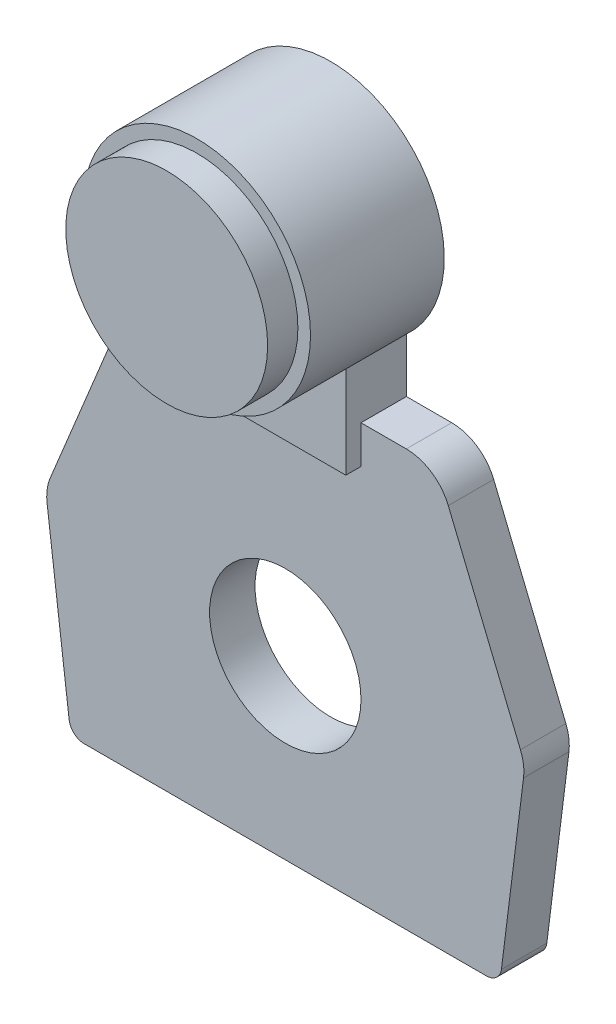
ISO-10303-21;
HEADER;
FILE_DESCRIPTION(('STEP AP214'),'2;1');
FILE_NAME('part.step','',(''),(''),'','','');
FILE_SCHEMA(('AUTOMOTIVE_DESIGN { 1 0 10303 214 1 1 1 1 }'));
ENDSEC;
DATA;
#1=APPLICATION_CONTEXT('core data for automotive mechanical design processes');
#2=APPLICATION_PROTOCOL_DEFINITION('international standard','automotive_design',2000,#1);
#3=PRODUCT_CONTEXT('',#1,'mechanical');
#4=PRODUCT('Part','Part','',(#3));
#5=PRODUCT_RELATED_PRODUCT_CATEGORY('part','',(#4));
#6=PRODUCT_DEFINITION_FORMATION('','',#4);
#7=PRODUCT_DEFINITION_CONTEXT('part definition',#1,'design');
#8=PRODUCT_DEFINITION('design','',#6,#7);
#9=PRODUCT_DEFINITION_SHAPE('','',#8);
#10=(LENGTH_UNIT() NAMED_UNIT(*) SI_UNIT(.MILLI.,.METRE.));
#11=(NAMED_UNIT(*) PLANE_ANGLE_UNIT() SI_UNIT($,.RADIAN.));
#12=(NAMED_UNIT(*) SI_UNIT($,.STERADIAN.) SOLID_ANGLE_UNIT());
#13=UNCERTAINTY_MEASURE_WITH_UNIT(LENGTH_MEASURE(1.E-05),#10,'distance_accuracy_value','');
#14=(GEOMETRIC_REPRESENTATION_CONTEXT(3) GLOBAL_UNCERTAINTY_ASSIGNED_CONTEXT((#13)) GLOBAL_UNIT_ASSIGNED_CONTEXT((#10,
#11,#12)) REPRESENTATION_CONTEXT('',''));
#15=CARTESIAN_POINT('',(0.,0.,0.));
#16=DIRECTION('',(0.,0.,1.));
#17=DIRECTION('',(1.,0.,0.));
#18=AXIS2_PLACEMENT_3D('',#15,#16,#17);
#19=CARTESIAN_POINT('',(-30.,150.,96.));
#20=DIRECTION('',(1.,0.,0.));
#21=DIRECTION('',(0.,0.,-1.));
#22=AXIS2_PLACEMENT_3D('',#19,#20,#21);
#23=PLANE('',#22);
#24=DIRECTION('',(0.,0.,-1.));
#25=VECTOR('',#24,1.);
#26=CARTESIAN_POINT('',(-30.,116.458980337503,125.));
#27=LINE('',#26,#25);
#28=CARTESIAN_POINT('',(-30.,116.458980337503,72.));
#29=VERTEX_POINT('',#28);
#30=CARTESIAN_POINT('',(-30.,116.458980337503,96.));
#31=VERTEX_POINT('',#30);
#32=EDGE_CURVE('E59',#29,#31,#27,.F.);
#33=ORIENTED_EDGE('',*,*,#32,.F.);
#34=DIRECTION('',(0.,-1.,0.));
#35=VECTOR('',#34,1.);
#36=CARTESIAN_POINT('',(-30.,150.,72.));
#37=LINE('',#36,#35);
#38=CARTESIAN_POINT('',(-30.,95.,72.));
#39=VERTEX_POINT('',#38);
#40=EDGE_CURVE('E179',#29,#39,#37,.T.);
#41=ORIENTED_EDGE('',*,*,#40,.T.);
#42=DIRECTION('',(0.,0.,1.));
#43=VECTOR('',#42,1.);
#44=CARTESIAN_POINT('',(-30.,95.,90.));
#45=LINE('',#44,#43);
#46=CARTESIAN_POINT('',(-30.,95.,90.));
#47=VERTEX_POINT('',#46);
#48=EDGE_CURVE('E203',#39,#47,#45,.T.);
#49=ORIENTED_EDGE('',*,*,#48,.T.);
#50=DIRECTION('',(0.,1.,0.));
#51=VECTOR('',#50,1.);
#52=CARTESIAN_POINT('',(-30.,-64.,90.));
#53=LINE('',#52,#51);
#54=CARTESIAN_POINT('',(-30.,80.,90.));
#55=VERTEX_POINT('',#54);
#56=EDGE_CURVE('E299',#55,#47,#53,.T.);
#57=ORIENTED_EDGE('',*,*,#56,.F.);
#58=DIRECTION('',(0.,0.,-1.));
#59=VECTOR('',#58,1.);
#60=CARTESIAN_POINT('',(-30.,80.,96.));
#61=LINE('',#60,#59);
#62=CARTESIAN_POINT('',(-30.,80.,96.));
#63=VERTEX_POINT('',#62);
#64=EDGE_CURVE('E200',#63,#55,#61,.T.);
#65=ORIENTED_EDGE('',*,*,#64,.F.);
#66=DIRECTION('',(0.,-1.,0.));
#67=VECTOR('',#66,1.);
#68=CARTESIAN_POINT('',(-30.,150.,96.));
#69=LINE('',#68,#67);
#70=EDGE_CURVE('E182',#31,#63,#69,.T.);
#71=ORIENTED_EDGE('',*,*,#70,.F.);
#72=EDGE_LOOP('',(#33,#41,#49,#57,#65,#71));
#73=FACE_BOUND('',#72,.T.);
#74=ADVANCED_FACE('F41',(#73),#23,.F.);
#75=CARTESIAN_POINT('',(30.,80.,96.));
#76=DIRECTION('',(-1.,0.,0.));
#77=DIRECTION('',(0.,0.,1.));
#78=AXIS2_PLACEMENT_3D('',#75,#76,#77);
#79=PLANE('',#78);
#80=DIRECTION('',(0.,0.,-1.));
#81=VECTOR('',#80,1.);
#82=CARTESIAN_POINT('',(30.,116.458980337503,125.));
#83=LINE('',#82,#81);
#84=CARTESIAN_POINT('',(30.,116.458980337503,96.));
#85=VERTEX_POINT('',#84);
#86=CARTESIAN_POINT('',(30.,116.458980337503,72.));
#87=VERTEX_POINT('',#86);
#88=EDGE_CURVE('E167',#85,#87,#83,.T.);
#89=ORIENTED_EDGE('',*,*,#88,.F.);
#90=DIRECTION('',(0.,1.,0.));
#91=VECTOR('',#90,1.);
#92=CARTESIAN_POINT('',(30.,80.,96.));
#93=LINE('',#92,#91);
#94=CARTESIAN_POINT('',(30.,80.,96.));
#95=VERTEX_POINT('',#94);
#96=EDGE_CURVE('E194',#95,#85,#93,.T.);
#97=ORIENTED_EDGE('',*,*,#96,.F.);
#98=DIRECTION('',(0.,0.,-1.));
#99=VECTOR('',#98,1.);
#100=CARTESIAN_POINT('',(30.,80.,96.));
#101=LINE('',#100,#99);
#102=CARTESIAN_POINT('',(30.,80.,90.));
#103=VERTEX_POINT('',#102);
#104=EDGE_CURVE('E67',#95,#103,#101,.T.);
#105=ORIENTED_EDGE('',*,*,#104,.T.);
#106=DIRECTION('',(0.,-1.,0.));
#107=VECTOR('',#106,1.);
#108=CARTESIAN_POINT('',(30.,-64.,90.));
#109=LINE('',#108,#107);
#110=CARTESIAN_POINT('',(30.,95.,90.));
#111=VERTEX_POINT('',#110);
#112=EDGE_CURVE('E298',#111,#103,#109,.T.);
#113=ORIENTED_EDGE('',*,*,#112,.F.);
#114=DIRECTION('',(0.,0.,-1.));
#115=VECTOR('',#114,1.);
#116=CARTESIAN_POINT('',(30.,95.,90.));
#117=LINE('',#116,#115);
#118=CARTESIAN_POINT('',(30.,95.,72.));
#119=VERTEX_POINT('',#118);
#120=EDGE_CURVE('E205',#111,#119,#117,.T.);
#121=ORIENTED_EDGE('',*,*,#120,.T.);
#122=DIRECTION('',(0.,1.,0.));
#123=VECTOR('',#122,1.);
#124=CARTESIAN_POINT('',(30.,80.,72.));
#125=LINE('',#124,#123);
#126=EDGE_CURVE('E186',#119,#87,#125,.T.);
#127=ORIENTED_EDGE('',*,*,#126,.T.);
#128=EDGE_LOOP('',(#89,#97,#105,#113,#121,#127));
#129=FACE_BOUND('',#128,.T.);
#130=ADVANCED_FACE('F304',(#129),#79,.F.);
#131=CARTESIAN_POINT('',(47.9455309649821,95.,90.));
#132=DIRECTION('',(0.,-1.,0.));
#133=DIRECTION('',(0.,0.,-1.));
#134=AXIS2_PLACEMENT_3D('',#131,#132,#133);
#135=PLANE('',#134);
#136=ORIENTED_EDGE('',*,*,#48,.F.);
#137=DIRECTION('',(-1.,0.,0.));
#138=VECTOR('',#137,1.);
#139=CARTESIAN_POINT('',(47.9455309649821,95.,72.));
#140=LINE('',#139,#138);
#141=CARTESIAN_POINT('',(-47.9455309649821,95.,72.));
#142=VERTEX_POINT('',#141);
#143=EDGE_CURVE('E189',#39,#142,#140,.T.);
#144=ORIENTED_EDGE('',*,*,#143,.T.);
#145=DIRECTION('',(0.,0.,-1.));
#146=VECTOR('',#145,1.);
#147=CARTESIAN_POINT('',(-47.9455309649821,95.,90.));
#148=LINE('',#147,#146);
#149=CARTESIAN_POINT('',(-47.9455309649821,95.,90.));
#150=VERTEX_POINT('',#149);
#151=EDGE_CURVE('E275',#150,#142,#148,.T.);
#152=ORIENTED_EDGE('',*,*,#151,.F.);
#153=DIRECTION('',(-1.,0.,0.));
#154=VECTOR('',#153,1.);
#155=CARTESIAN_POINT('',(47.9455309649821,95.,90.));
#156=LINE('',#155,#154);
#157=EDGE_CURVE('E221',#47,#150,#156,.T.);
#158=ORIENTED_EDGE('',*,*,#157,.F.);
#159=EDGE_LOOP('',(#136,#144,#152,#158));
#160=FACE_BOUND('',#159,.T.);
#161=ADVANCED_FACE('F372',(#160),#135,.F.);
#162=ORIENTED_EDGE('',*,*,#120,.F.);
#163=CARTESIAN_POINT('',(47.9455309649821,95.,90.));
#164=VERTEX_POINT('',#163);
#165=EDGE_CURVE('E223',#164,#111,#156,.T.);
#166=ORIENTED_EDGE('',*,*,#165,.F.);
#167=DIRECTION('',(0.,0.,-1.));
#168=VECTOR('',#167,1.);
#169=CARTESIAN_POINT('',(47.9455309649821,95.,90.));
#170=LINE('',#169,#168);
#171=CARTESIAN_POINT('',(47.9455309649821,95.,72.));
#172=VERTEX_POINT('',#171);
#173=EDGE_CURVE('E273',#164,#172,#170,.T.);
#174=ORIENTED_EDGE('',*,*,#173,.T.);
#175=EDGE_CURVE('E252',#172,#119,#140,.T.);
#176=ORIENTED_EDGE('',*,*,#175,.T.);
#177=EDGE_LOOP('',(#162,#166,#174,#176));
#178=FACE_BOUND('',#177,.T.);
#179=ADVANCED_FACE('F319',(#178),#135,.F.);
#180=CARTESIAN_POINT('',(-79.7033066887761,-64.,90.));
#181=DIRECTION('',(0.,0.,1.));
#182=DIRECTION('',(1.,0.,0.));
#183=AXIS2_PLACEMENT_3D('',#180,#181,#182);
#184=PLANE('',#183);
#185=CARTESIAN_POINT('',(0.,0.,90.));
#186=DIRECTION('',(0.,0.,1.));
#187=DIRECTION('',(1.,0.,0.));
#188=AXIS2_PLACEMENT_3D('',#185,#186,#187);
#189=CIRCLE('',#188,30.);
#190=CARTESIAN_POINT('',(30.,0.,90.));
#191=VERTEX_POINT('',#190);
#192=EDGE_CURVE('E582',#191,#191,#189,.F.);
#193=ORIENTED_EDGE('',*,*,#192,.T.);
#194=EDGE_LOOP('',(#193));
#195=FACE_BOUND('',#194,.T.);
#196=DIRECTION('',(-1.,0.,0.));
#197=VECTOR('',#196,1.);
#198=CARTESIAN_POINT('',(-79.7033066887761,80.,90.));
#199=LINE('',#198,#197);
#200=EDGE_CURVE('E196',#103,#55,#199,.T.);
#201=ORIENTED_EDGE('',*,*,#200,.T.);
#202=ORIENTED_EDGE('',*,*,#56,.T.);
#203=ORIENTED_EDGE('',*,*,#157,.T.);
#204=CARTESIAN_POINT('',(-47.9455309649821,77.,90.));
#205=DIRECTION('',(0.,0.,1.));
#206=DIRECTION('',(1.,0.,0.));
#207=AXIS2_PLACEMENT_3D('',#204,#205,#206);
#208=CIRCLE('',#207,18.);
#209=CARTESIAN_POINT('',(-64.589736737527,83.8534964945773,90.));
#210=VERTEX_POINT('',#209);
#211=EDGE_CURVE('E226',#150,#210,#208,.T.);
#212=ORIENTED_EDGE('',*,*,#211,.T.);
#213=DIRECTION('',(-0.380749805254295,-0.924678098474716,0.));
#214=VECTOR('',#213,1.);
#215=CARTESIAN_POINT('',(-64.589736737527,83.8534964945773,90.));
#216=LINE('',#215,#214);
#217=CARTESIAN_POINT('',(-93.1952955002035,14.3828537852201,90.));
#218=VERTEX_POINT('',#217);
#219=EDGE_CURVE('E229',#210,#218,#216,.T.);
#220=ORIENTED_EDGE('',*,*,#219,.T.);
#221=CARTESIAN_POINT('',(-76.5510897276586,7.52935729064277,90.));
#222=DIRECTION('',(0.,0.,1.));
#223=DIRECTION('',(1.,0.,0.));
#224=AXIS2_PLACEMENT_3D('',#221,#222,#223);
#225=CIRCLE('',#224,18.);
#226=CARTESIAN_POINT('',(-94.4120915085046,5.29673206803702,90.));
#227=VERTEX_POINT('',#226);
#228=EDGE_CURVE('E235',#218,#227,#225,.T.);
#229=ORIENTED_EDGE('',*,*,#228,.T.);
#230=DIRECTION('',(0.124034734589208,-0.992277876713668,0.));
#231=VECTOR('',#230,1.);
#232=CARTESIAN_POINT('',(-94.4120915085046,5.29673206803702,90.));
#233=LINE('',#232,#231);
#234=CARTESIAN_POINT('',(-85.6569739490581,-64.7442084075353,90.));
#235=VERTEX_POINT('',#234);
#236=EDGE_CURVE('E234',#227,#235,#233,.T.);
#237=ORIENTED_EDGE('',*,*,#236,.T.);
#238=CARTESIAN_POINT('',(-79.7033066887761,-64.,90.));
#239=DIRECTION('',(0.,0.,1.));
#240=DIRECTION('',(1.,0.,0.));
#241=AXIS2_PLACEMENT_3D('',#238,#239,#240);
#242=CIRCLE('',#241,6.);
#243=CARTESIAN_POINT('',(-79.7033066887761,-70.,90.));
#244=VERTEX_POINT('',#243);
#245=EDGE_CURVE('E206',#235,#244,#242,.T.);
#246=ORIENTED_EDGE('',*,*,#245,.T.);
#247=DIRECTION('',(1.,0.,0.));
#248=VECTOR('',#247,1.);
#249=CARTESIAN_POINT('',(-79.7033066887761,-70.,90.));
#250=LINE('',#249,#248);
#251=CARTESIAN_POINT('',(79.7033066887761,-70.,90.));
#252=VERTEX_POINT('',#251);
#253=EDGE_CURVE('E211',#244,#252,#250,.T.);
#254=ORIENTED_EDGE('',*,*,#253,.T.);
#255=CARTESIAN_POINT('',(79.7033066887761,-64.,90.));
#256=DIRECTION('',(0.,0.,1.));
#257=DIRECTION('',(1.,0.,0.));
#258=AXIS2_PLACEMENT_3D('',#255,#256,#257);
#259=CIRCLE('',#258,6.);
#260=CARTESIAN_POINT('',(85.6569739490581,-64.7442084075353,90.));
#261=VERTEX_POINT('',#260);
#262=EDGE_CURVE('E213',#252,#261,#259,.T.);
#263=ORIENTED_EDGE('',*,*,#262,.T.);
#264=DIRECTION('',(0.124034734589208,0.992277876713668,0.));
#265=VECTOR('',#264,1.);
#266=CARTESIAN_POINT('',(85.6569739490581,-64.7442084075353,90.));
#267=LINE('',#266,#265);
#268=CARTESIAN_POINT('',(94.4120915085046,5.29673206803701,90.));
#269=VERTEX_POINT('',#268);
#270=EDGE_CURVE('E217',#261,#269,#267,.T.);
#271=ORIENTED_EDGE('',*,*,#270,.T.);
#272=CARTESIAN_POINT('',(76.5510897276586,7.52935729064277,90.));
#273=DIRECTION('',(0.,0.,1.));
#274=DIRECTION('',(1.,0.,0.));
#275=AXIS2_PLACEMENT_3D('',#272,#273,#274);
#276=CIRCLE('',#275,18.);
#277=CARTESIAN_POINT('',(93.1952955002035,14.3828537852201,90.));
#278=VERTEX_POINT('',#277);
#279=EDGE_CURVE('E218',#269,#278,#276,.T.);
#280=ORIENTED_EDGE('',*,*,#279,.T.);
#281=DIRECTION('',(-0.380749805254295,0.924678098474716,0.));
#282=VECTOR('',#281,1.);
#283=CARTESIAN_POINT('',(93.1952955002035,14.3828537852201,90.));
#284=LINE('',#283,#282);
#285=CARTESIAN_POINT('',(64.589736737527,83.8534964945773,90.));
#286=VERTEX_POINT('',#285);
#287=EDGE_CURVE('E216',#278,#286,#284,.T.);
#288=ORIENTED_EDGE('',*,*,#287,.T.);
#289=CARTESIAN_POINT('',(47.9455309649821,77.,90.));
#290=DIRECTION('',(0.,0.,1.));
#291=DIRECTION('',(1.,0.,0.));
#292=AXIS2_PLACEMENT_3D('',#289,#290,#291);
#293=CIRCLE('',#292,18.);
#294=EDGE_CURVE('E224',#286,#164,#293,.T.);
#295=ORIENTED_EDGE('',*,*,#294,.T.);
#296=ORIENTED_EDGE('',*,*,#165,.T.);
#297=ORIENTED_EDGE('',*,*,#112,.T.);
#298=EDGE_LOOP('',(#201,#202,#203,#212,#220,#229,#237,#246,#254,#263,#271,#280,#288,#295,#296,#297));
#299=FACE_BOUND('',#298,.T.);
#300=ADVANCED_FACE('F313',(#195,#299),#184,.T.);
#301=CARTESIAN_POINT('',(-79.7033066887761,-64.,90.));
#302=DIRECTION('',(0.,0.,-1.));
#303=DIRECTION('',(-1.,0.,0.));
#304=AXIS2_PLACEMENT_3D('',#301,#302,#303);
#305=CYLINDRICAL_SURFACE('',#304,6.);
#306=CARTESIAN_POINT('',(-79.7033066887761,-64.,72.));
#307=DIRECTION('',(0.,0.,1.));
#308=DIRECTION('',(1.,0.,0.));
#309=AXIS2_PLACEMENT_3D('',#306,#307,#308);
#310=CIRCLE('',#309,6.);
#311=CARTESIAN_POINT('',(-85.6569739490581,-64.7442084075353,72.));
#312=VERTEX_POINT('',#311);
#313=CARTESIAN_POINT('',(-79.7033066887761,-70.,72.));
#314=VERTEX_POINT('',#313);
#315=EDGE_CURVE('E210',#312,#314,#310,.T.);
#316=ORIENTED_EDGE('',*,*,#315,.T.);
#317=DIRECTION('',(0.,0.,-1.));
#318=VECTOR('',#317,1.);
#319=CARTESIAN_POINT('',(-79.7033066887761,-70.,90.));
#320=LINE('',#319,#318);
#321=EDGE_CURVE('E291',#244,#314,#320,.T.);
#322=ORIENTED_EDGE('',*,*,#321,.F.);
#323=ORIENTED_EDGE('',*,*,#245,.F.);
#324=DIRECTION('',(0.,0.,-1.));
#325=VECTOR('',#324,1.);
#326=CARTESIAN_POINT('',(-85.6569739490581,-64.7442084075353,90.));
#327=LINE('',#326,#325);
#328=EDGE_CURVE('E236',#235,#312,#327,.T.);
#329=ORIENTED_EDGE('',*,*,#328,.T.);
#330=EDGE_LOOP('',(#316,#322,#323,#329));
#331=FACE_BOUND('',#330,.T.);
#332=ADVANCED_FACE('F43',(#331),#305,.T.);
#333=CARTESIAN_POINT('',(-79.7033066887761,-70.,90.));
#334=DIRECTION('',(0.,1.,0.));
#335=DIRECTION('',(0.,0.,1.));
#336=AXIS2_PLACEMENT_3D('',#333,#334,#335);
#337=PLANE('',#336);
#338=DIRECTION('',(1.,0.,0.));
#339=VECTOR('',#338,1.);
#340=CARTESIAN_POINT('',(-79.7033066887761,-70.,72.));
#341=LINE('',#340,#339);
#342=CARTESIAN_POINT('',(79.7033066887761,-70.,72.));
#343=VERTEX_POINT('',#342);
#344=EDGE_CURVE('E237',#314,#343,#341,.T.);
#345=ORIENTED_EDGE('',*,*,#344,.T.);
#346=DIRECTION('',(0.,0.,-1.));
#347=VECTOR('',#346,1.);
#348=CARTESIAN_POINT('',(79.7033066887761,-70.,90.));
#349=LINE('',#348,#347);
#350=EDGE_CURVE('E288',#252,#343,#349,.T.);
#351=ORIENTED_EDGE('',*,*,#350,.F.);
#352=ORIENTED_EDGE('',*,*,#253,.F.);
#353=ORIENTED_EDGE('',*,*,#321,.T.);
#354=EDGE_LOOP('',(#345,#351,#352,#353));
#355=FACE_BOUND('',#354,.T.);
#356=ADVANCED_FACE('F350',(#355),#337,.F.);
#357=CARTESIAN_POINT('',(79.7033066887761,-64.,90.));
#358=DIRECTION('',(0.,0.,-1.));
#359=DIRECTION('',(-1.,0.,0.));
#360=AXIS2_PLACEMENT_3D('',#357,#358,#359);
#361=CYLINDRICAL_SURFACE('',#360,6.);
#362=CARTESIAN_POINT('',(79.7033066887761,-64.,72.));
#363=DIRECTION('',(0.,0.,1.));
#364=DIRECTION('',(1.,0.,0.));
#365=AXIS2_PLACEMENT_3D('',#362,#363,#364);
#366=CIRCLE('',#365,6.);
#367=CARTESIAN_POINT('',(85.6569739490581,-64.7442084075353,72.));
#368=VERTEX_POINT('',#367);
#369=EDGE_CURVE('E241',#343,#368,#366,.T.);
#370=ORIENTED_EDGE('',*,*,#369,.T.);
#371=DIRECTION('',(0.,0.,-1.));
#372=VECTOR('',#371,1.);
#373=CARTESIAN_POINT('',(85.6569739490581,-64.7442084075353,90.));
#374=LINE('',#373,#372);
#375=EDGE_CURVE('E289',#261,#368,#374,.T.);
#376=ORIENTED_EDGE('',*,*,#375,.F.);
#377=ORIENTED_EDGE('',*,*,#262,.F.);
#378=ORIENTED_EDGE('',*,*,#350,.T.);
#379=EDGE_LOOP('',(#370,#376,#377,#378));
#380=FACE_BOUND('',#379,.T.);
#381=ADVANCED_FACE('F343',(#380),#361,.T.);
#382=CARTESIAN_POINT('',(85.6569739490581,-64.7442084075353,90.));
#383=DIRECTION('',(-0.992277876713668,0.124034734589209,0.));
#384=DIRECTION('',(-0.124034734589209,-0.992277876713668,0.));
#385=AXIS2_PLACEMENT_3D('',#382,#383,#384);
#386=PLANE('',#385);
#387=DIRECTION('',(0.124034734589208,0.992277876713668,0.));
#388=VECTOR('',#387,1.);
#389=CARTESIAN_POINT('',(85.6569739490581,-64.7442084075353,72.));
#390=LINE('',#389,#388);
#391=CARTESIAN_POINT('',(94.4120915085046,5.29673206803701,72.));
#392=VERTEX_POINT('',#391);
#393=EDGE_CURVE('E243',#368,#392,#390,.T.);
#394=ORIENTED_EDGE('',*,*,#393,.T.);
#395=DIRECTION('',(0.,0.,-1.));
#396=VECTOR('',#395,1.);
#397=CARTESIAN_POINT('',(94.4120915085046,5.29673206803701,90.));
#398=LINE('',#397,#396);
#399=EDGE_CURVE('E284',#269,#392,#398,.T.);
#400=ORIENTED_EDGE('',*,*,#399,.F.);
#401=ORIENTED_EDGE('',*,*,#270,.F.);
#402=ORIENTED_EDGE('',*,*,#375,.T.);
#403=EDGE_LOOP('',(#394,#400,#401,#402));
#404=FACE_BOUND('',#403,.T.);
#405=ADVANCED_FACE('F339',(#404),#386,.F.);
#406=CARTESIAN_POINT('',(76.5510897276586,7.52935729064277,90.));
#407=DIRECTION('',(0.,0.,-1.));
#408=DIRECTION('',(-1.,0.,0.));
#409=AXIS2_PLACEMENT_3D('',#406,#407,#408);
#410=CYLINDRICAL_SURFACE('',#409,18.);
#411=CARTESIAN_POINT('',(76.5510897276586,7.52935729064277,72.));
#412=DIRECTION('',(0.,0.,1.));
#413=DIRECTION('',(1.,0.,0.));
#414=AXIS2_PLACEMENT_3D('',#411,#412,#413);
#415=CIRCLE('',#414,18.);
#416=CARTESIAN_POINT('',(93.1952955002035,14.3828537852201,72.));
#417=VERTEX_POINT('',#416);
#418=EDGE_CURVE('E244',#392,#417,#415,.T.);
#419=ORIENTED_EDGE('',*,*,#418,.T.);
#420=DIRECTION('',(0.,0.,-1.));
#421=VECTOR('',#420,1.);
#422=CARTESIAN_POINT('',(93.1952955002035,14.3828537852201,90.));
#423=LINE('',#422,#421);
#424=EDGE_CURVE('E282',#278,#417,#423,.T.);
#425=ORIENTED_EDGE('',*,*,#424,.F.);
#426=ORIENTED_EDGE('',*,*,#279,.F.);
#427=ORIENTED_EDGE('',*,*,#399,.T.);
#428=EDGE_LOOP('',(#419,#425,#426,#427));
#429=FACE_BOUND('',#428,.T.);
#430=ADVANCED_FACE('F331',(#429),#410,.T.);
#431=CARTESIAN_POINT('',(93.1952955002035,14.3828537852201,90.));
#432=DIRECTION('',(-0.924678098474716,-0.380749805254295,0.));
#433=DIRECTION('',(0.380749805254295,-0.924678098474716,0.));
#434=AXIS2_PLACEMENT_3D('',#431,#432,#433);
#435=PLANE('',#434);
#436=DIRECTION('',(-0.380749805254295,0.924678098474716,0.));
#437=VECTOR('',#436,1.);
#438=CARTESIAN_POINT('',(93.1952955002035,14.3828537852201,72.));
#439=LINE('',#438,#437);
#440=CARTESIAN_POINT('',(64.589736737527,83.8534964945773,72.));
#441=VERTEX_POINT('',#440);
#442=EDGE_CURVE('E250',#417,#441,#439,.T.);
#443=ORIENTED_EDGE('',*,*,#442,.T.);
#444=DIRECTION('',(0.,0.,-1.));
#445=VECTOR('',#444,1.);
#446=CARTESIAN_POINT('',(64.589736737527,83.8534964945773,90.));
#447=LINE('',#446,#445);
#448=EDGE_CURVE('E279',#286,#441,#447,.T.);
#449=ORIENTED_EDGE('',*,*,#448,.F.);
#450=ORIENTED_EDGE('',*,*,#287,.F.);
#451=ORIENTED_EDGE('',*,*,#424,.T.);
#452=EDGE_LOOP('',(#443,#449,#450,#451));
#453=FACE_BOUND('',#452,.T.);
#454=ADVANCED_FACE('F326',(#453),#435,.F.);
#455=CARTESIAN_POINT('',(47.9455309649821,77.,90.));
#456=DIRECTION('',(0.,0.,-1.));
#457=DIRECTION('',(-1.,0.,0.));
#458=AXIS2_PLACEMENT_3D('',#455,#456,#457);
#459=CYLINDRICAL_SURFACE('',#458,18.);
#460=CARTESIAN_POINT('',(47.9455309649821,77.,72.));
#461=DIRECTION('',(0.,0.,1.));
#462=DIRECTION('',(1.,0.,0.));
#463=AXIS2_PLACEMENT_3D('',#460,#461,#462);
#464=CIRCLE('',#463,18.);
#465=EDGE_CURVE('E248',#441,#172,#464,.T.);
#466=ORIENTED_EDGE('',*,*,#465,.T.);
#467=ORIENTED_EDGE('',*,*,#173,.F.);
#468=ORIENTED_EDGE('',*,*,#294,.F.);
#469=ORIENTED_EDGE('',*,*,#448,.T.);
#470=EDGE_LOOP('',(#466,#467,#468,#469));
#471=FACE_BOUND('',#470,.T.);
#472=ADVANCED_FACE('F325',(#471),#459,.T.);
#473=CARTESIAN_POINT('',(-47.9455309649821,77.,90.));
#474=DIRECTION('',(0.,0.,-1.));
#475=DIRECTION('',(-1.,0.,0.));
#476=AXIS2_PLACEMENT_3D('',#473,#474,#475);
#477=CYLINDRICAL_SURFACE('',#476,18.);
#478=CARTESIAN_POINT('',(-47.9455309649821,77.,72.));
#479=DIRECTION('',(0.,0.,1.));
#480=DIRECTION('',(1.,0.,0.));
#481=AXIS2_PLACEMENT_3D('',#478,#479,#480);
#482=CIRCLE('',#481,18.);
#483=CARTESIAN_POINT('',(-64.589736737527,83.8534964945773,72.));
#484=VERTEX_POINT('',#483);
#485=EDGE_CURVE('E251',#142,#484,#482,.T.);
#486=ORIENTED_EDGE('',*,*,#485,.T.);
#487=DIRECTION('',(0.,0.,-1.));
#488=VECTOR('',#487,1.);
#489=CARTESIAN_POINT('',(-64.589736737527,83.8534964945773,90.));
#490=LINE('',#489,#488);
#491=EDGE_CURVE('E266',#210,#484,#490,.T.);
#492=ORIENTED_EDGE('',*,*,#491,.F.);
#493=ORIENTED_EDGE('',*,*,#211,.F.);
#494=ORIENTED_EDGE('',*,*,#151,.T.);
#495=EDGE_LOOP('',(#486,#492,#493,#494));
#496=FACE_BOUND('',#495,.T.);
#497=ADVANCED_FACE('F369',(#496),#477,.T.);
#498=CARTESIAN_POINT('',(-64.589736737527,83.8534964945773,90.));
#499=DIRECTION('',(0.924678098474716,-0.380749805254295,0.));
#500=DIRECTION('',(0.380749805254295,0.924678098474716,0.));
#501=AXIS2_PLACEMENT_3D('',#498,#499,#500);
#502=PLANE('',#501);
#503=DIRECTION('',(-0.380749805254295,-0.924678098474716,0.));
#504=VECTOR('',#503,1.);
#505=CARTESIAN_POINT('',(-64.589736737527,83.8534964945773,72.));
#506=LINE('',#505,#504);
#507=CARTESIAN_POINT('',(-93.1952955002035,14.3828537852201,72.));
#508=VERTEX_POINT('',#507);
#509=EDGE_CURVE('E256',#484,#508,#506,.T.);
#510=ORIENTED_EDGE('',*,*,#509,.T.);
#511=DIRECTION('',(0.,0.,-1.));
#512=VECTOR('',#511,1.);
#513=CARTESIAN_POINT('',(-93.1952955002035,14.3828537852201,90.));
#514=LINE('',#513,#512);
#515=EDGE_CURVE('E267',#218,#508,#514,.T.);
#516=ORIENTED_EDGE('',*,*,#515,.F.);
#517=ORIENTED_EDGE('',*,*,#219,.F.);
#518=ORIENTED_EDGE('',*,*,#491,.T.);
#519=EDGE_LOOP('',(#510,#516,#517,#518));
#520=FACE_BOUND('',#519,.T.);
#521=ADVANCED_FACE('F362',(#520),#502,.F.);
#522=CARTESIAN_POINT('',(-76.5510897276586,7.52935729064277,90.));
#523=DIRECTION('',(0.,0.,-1.));
#524=DIRECTION('',(-1.,0.,0.));
#525=AXIS2_PLACEMENT_3D('',#522,#523,#524);
#526=CYLINDRICAL_SURFACE('',#525,18.);
#527=CARTESIAN_POINT('',(-76.5510897276586,7.52935729064277,72.));
#528=DIRECTION('',(0.,0.,1.));
#529=DIRECTION('',(1.,0.,0.));
#530=AXIS2_PLACEMENT_3D('',#527,#528,#529);
#531=CIRCLE('',#530,18.);
#532=CARTESIAN_POINT('',(-94.4120915085046,5.29673206803702,72.));
#533=VERTEX_POINT('',#532);
#534=EDGE_CURVE('E259',#508,#533,#531,.T.);
#535=ORIENTED_EDGE('',*,*,#534,.T.);
#536=DIRECTION('',(0.,0.,-1.));
#537=VECTOR('',#536,1.);
#538=CARTESIAN_POINT('',(-94.4120915085046,5.29673206803702,90.));
#539=LINE('',#538,#537);
#540=EDGE_CURVE('E263',#227,#533,#539,.T.);
#541=ORIENTED_EDGE('',*,*,#540,.F.);
#542=ORIENTED_EDGE('',*,*,#228,.F.);
#543=ORIENTED_EDGE('',*,*,#515,.T.);
#544=EDGE_LOOP('',(#535,#541,#542,#543));
#545=FACE_BOUND('',#544,.T.);
#546=ADVANCED_FACE('F363',(#545),#526,.T.);
#547=CARTESIAN_POINT('',(-94.4120915085046,5.29673206803702,90.));
#548=DIRECTION('',(0.992277876713668,0.124034734589209,0.));
#549=DIRECTION('',(-0.124034734589209,0.992277876713668,0.));
#550=AXIS2_PLACEMENT_3D('',#547,#548,#549);
#551=PLANE('',#550);
#552=DIRECTION('',(0.124034734589208,-0.992277876713668,0.));
#553=VECTOR('',#552,1.);
#554=CARTESIAN_POINT('',(-94.4120915085046,5.29673206803702,72.));
#555=LINE('',#554,#553);
#556=EDGE_CURVE('E212',#533,#312,#555,.T.);
#557=ORIENTED_EDGE('',*,*,#556,.T.);
#558=ORIENTED_EDGE('',*,*,#328,.F.);
#559=ORIENTED_EDGE('',*,*,#236,.F.);
#560=ORIENTED_EDGE('',*,*,#540,.T.);
#561=EDGE_LOOP('',(#557,#558,#559,#560));
#562=FACE_BOUND('',#561,.T.);
#563=ADVANCED_FACE('F357',(#562),#551,.F.);
#564=CARTESIAN_POINT('',(-79.7033066887761,-64.,72.));
#565=DIRECTION('',(0.,0.,1.));
#566=DIRECTION('',(1.,0.,0.));
#567=AXIS2_PLACEMENT_3D('',#564,#565,#566);
#568=PLANE('',#567);
#569=CARTESIAN_POINT('',(0.,0.,72.));
#570=DIRECTION('',(0.,0.,1.));
#571=DIRECTION('',(1.,0.,0.));
#572=AXIS2_PLACEMENT_3D('',#569,#570,#571);
#573=CIRCLE('',#572,30.);
#574=CARTESIAN_POINT('',(30.,0.,72.));
#575=VERTEX_POINT('',#574);
#576=EDGE_CURVE('E44',#575,#575,#573,.F.);
#577=ORIENTED_EDGE('',*,*,#576,.F.);
#578=EDGE_LOOP('',(#577));
#579=FACE_BOUND('',#578,.T.);
#580=ORIENTED_EDGE('',*,*,#40,.F.);
#581=CARTESIAN_POINT('',(0.,150.,72.));
#582=DIRECTION('',(0.,0.,1.));
#583=DIRECTION('',(1.,0.,0.));
#584=AXIS2_PLACEMENT_3D('',#581,#582,#583);
#585=CIRCLE('',#584,45.);
#586=EDGE_CURVE('E170',#87,#29,#585,.T.);
#587=ORIENTED_EDGE('',*,*,#586,.F.);
#588=ORIENTED_EDGE('',*,*,#126,.F.);
#589=ORIENTED_EDGE('',*,*,#175,.F.);
#590=ORIENTED_EDGE('',*,*,#465,.F.);
#591=ORIENTED_EDGE('',*,*,#442,.F.);
#592=ORIENTED_EDGE('',*,*,#418,.F.);
#593=ORIENTED_EDGE('',*,*,#393,.F.);
#594=ORIENTED_EDGE('',*,*,#369,.F.);
#595=ORIENTED_EDGE('',*,*,#344,.F.);
#596=ORIENTED_EDGE('',*,*,#315,.F.);
#597=ORIENTED_EDGE('',*,*,#556,.F.);
#598=ORIENTED_EDGE('',*,*,#534,.F.);
#599=ORIENTED_EDGE('',*,*,#509,.F.);
#600=ORIENTED_EDGE('',*,*,#485,.F.);
#601=ORIENTED_EDGE('',*,*,#143,.F.);
#602=EDGE_LOOP('',(#580,#587,#588,#589,#590,#591,#592,#593,#594,#595,#596,#597,#598,#599,#600,#601));
#603=FACE_BOUND('',#602,.T.);
#604=ADVANCED_FACE('F187',(#579,#603),#568,.F.);
#605=CARTESIAN_POINT('',(-30.,80.,96.));
#606=DIRECTION('',(0.,1.,0.));
#607=DIRECTION('',(0.,0.,1.));
#608=AXIS2_PLACEMENT_3D('',#605,#606,#607);
#609=PLANE('',#608);
#610=ORIENTED_EDGE('',*,*,#200,.F.);
#611=ORIENTED_EDGE('',*,*,#104,.F.);
#612=DIRECTION('',(1.,0.,0.));
#613=VECTOR('',#612,1.);
#614=CARTESIAN_POINT('',(-30.,80.,96.));
#615=LINE('',#614,#613);
#616=EDGE_CURVE('E309',#63,#95,#615,.T.);
#617=ORIENTED_EDGE('',*,*,#616,.F.);
#618=ORIENTED_EDGE('',*,*,#64,.T.);
#619=EDGE_LOOP('',(#610,#611,#617,#618));
#620=FACE_BOUND('',#619,.T.);
#621=ADVANCED_FACE('F315',(#620),#609,.F.);
#622=CARTESIAN_POINT('',(0.,0.,96.));
#623=DIRECTION('',(0.,0.,1.));
#624=DIRECTION('',(1.,0.,0.));
#625=AXIS2_PLACEMENT_3D('',#622,#623,#624);
#626=PLANE('',#625);
#627=ORIENTED_EDGE('',*,*,#96,.T.);
#628=CARTESIAN_POINT('',(0.,150.,96.));
#629=DIRECTION('',(0.,0.,1.));
#630=DIRECTION('',(1.,0.,0.));
#631=AXIS2_PLACEMENT_3D('',#628,#629,#630);
#632=CIRCLE('',#631,45.);
#633=EDGE_CURVE('E49',#85,#31,#632,.F.);
#634=ORIENTED_EDGE('',*,*,#633,.T.);
#635=ORIENTED_EDGE('',*,*,#70,.T.);
#636=ORIENTED_EDGE('',*,*,#616,.T.);
#637=EDGE_LOOP('',(#627,#634,#635,#636));
#638=FACE_BOUND('',#637,.T.);
#639=ADVANCED_FACE('F303',(#638),#626,.T.);
#640=CARTESIAN_POINT('',(0.,150.,125.));
#641=DIRECTION('',(0.,0.,-1.));
#642=DIRECTION('',(-1.,0.,0.));
#643=AXIS2_PLACEMENT_3D('',#640,#641,#642);
#644=CYLINDRICAL_SURFACE('',#643,45.);
#645=CARTESIAN_POINT('',(0.,150.,125.));
#646=DIRECTION('',(0.,0.,1.));
#647=DIRECTION('',(1.,0.,0.));
#648=AXIS2_PLACEMENT_3D('',#645,#646,#647);
#649=CIRCLE('',#648,45.);
#650=CARTESIAN_POINT('',(45.,150.,125.));
#651=VERTEX_POINT('',#650);
#652=EDGE_CURVE('E174',#651,#651,#649,.T.);
#653=ORIENTED_EDGE('',*,*,#652,.F.);
#654=EDGE_LOOP('',(#653));
#655=FACE_BOUND('',#654,.T.);
#656=ORIENTED_EDGE('',*,*,#586,.T.);
#657=ORIENTED_EDGE('',*,*,#32,.T.);
#658=ORIENTED_EDGE('',*,*,#633,.F.);
#659=ORIENTED_EDGE('',*,*,#88,.T.);
#660=EDGE_LOOP('',(#656,#657,#658,#659));
#661=FACE_BOUND('',#660,.T.);
#662=ADVANCED_FACE('F166',(#655,#661),#644,.T.);
#663=CARTESIAN_POINT('',(0.,150.,125.));
#664=DIRECTION('',(0.,0.,1.));
#665=DIRECTION('',(1.,0.,0.));
#666=AXIS2_PLACEMENT_3D('',#663,#664,#665);
#667=PLANE('',#666);
#668=CARTESIAN_POINT('',(0.,150.,125.));
#669=DIRECTION('',(0.,0.,1.));
#670=DIRECTION('',(1.,0.,0.));
#671=AXIS2_PLACEMENT_3D('',#668,#669,#670);
#672=CIRCLE('',#671,40.);
#673=CARTESIAN_POINT('',(40.,150.,125.));
#674=VERTEX_POINT('',#673);
#675=EDGE_CURVE('E11',#674,#674,#672,.T.);
#676=ORIENTED_EDGE('',*,*,#675,.F.);
#677=EDGE_LOOP('',(#676));
#678=FACE_BOUND('',#677,.T.);
#679=ORIENTED_EDGE('',*,*,#652,.T.);
#680=EDGE_LOOP('',(#679));
#681=FACE_BOUND('',#680,.T.);
#682=ADVANCED_FACE('F528',(#678,#681),#667,.T.);
#683=CARTESIAN_POINT('',(0.,150.,137.));
#684=DIRECTION('',(0.,0.,-1.));
#685=DIRECTION('',(-1.,0.,0.));
#686=AXIS2_PLACEMENT_3D('',#683,#684,#685);
#687=CYLINDRICAL_SURFACE('',#686,40.);
#688=CARTESIAN_POINT('',(0.,150.,137.));
#689=DIRECTION('',(0.,0.,1.));
#690=DIRECTION('',(1.,0.,0.));
#691=AXIS2_PLACEMENT_3D('',#688,#689,#690);
#692=CIRCLE('',#691,40.);
#693=CARTESIAN_POINT('',(40.,150.,137.));
#694=VERTEX_POINT('',#693);
#695=EDGE_CURVE('E176',#694,#694,#692,.T.);
#696=ORIENTED_EDGE('',*,*,#695,.F.);
#697=EDGE_LOOP('',(#696));
#698=FACE_BOUND('',#697,.T.);
#699=ORIENTED_EDGE('',*,*,#675,.T.);
#700=EDGE_LOOP('',(#699));
#701=FACE_BOUND('',#700,.T.);
#702=ADVANCED_FACE('F538',(#698,#701),#687,.T.);
#703=CARTESIAN_POINT('',(0.,150.,137.));
#704=DIRECTION('',(0.,0.,1.));
#705=DIRECTION('',(1.,0.,0.));
#706=AXIS2_PLACEMENT_3D('',#703,#704,#705);
#707=PLANE('',#706);
#708=ORIENTED_EDGE('',*,*,#695,.T.);
#709=EDGE_LOOP('',(#708));
#710=FACE_BOUND('',#709,.T.);
#711=ADVANCED_FACE('F550',(#710),#707,.T.);
#712=CARTESIAN_POINT('',(0.,0.,72.));
#713=DIRECTION('',(0.,0.,-1.));
#714=DIRECTION('',(-1.,0.,0.));
#715=AXIS2_PLACEMENT_3D('',#712,#713,#714);
#716=CYLINDRICAL_SURFACE('',#715,30.);
#717=ORIENTED_EDGE('',*,*,#192,.F.);
#718=EDGE_LOOP('',(#717));
#719=FACE_BOUND('',#718,.T.);
#720=ORIENTED_EDGE('',*,*,#576,.T.);
#721=EDGE_LOOP('',(#720));
#722=FACE_BOUND('',#721,.T.);
#723=ADVANCED_FACE('F560',(#719,#722),#716,.F.);
#724=CLOSED_SHELL('',(#74,#130,#161,#179,#300,#332,#356,#381,#405,#430,#454,#472,#497,#521,#546,
#563,#604,#621,#639,#662,#682,#702,#711,#723));
#725=MANIFOLD_SOLID_BREP('B2',#724);
#726=ADVANCED_BREP_SHAPE_REPRESENTATION('',(#18,#725),#14);
#727=SHAPE_DEFINITION_REPRESENTATION(#9,#726);
ENDSEC;
END-ISO-10303-21;
